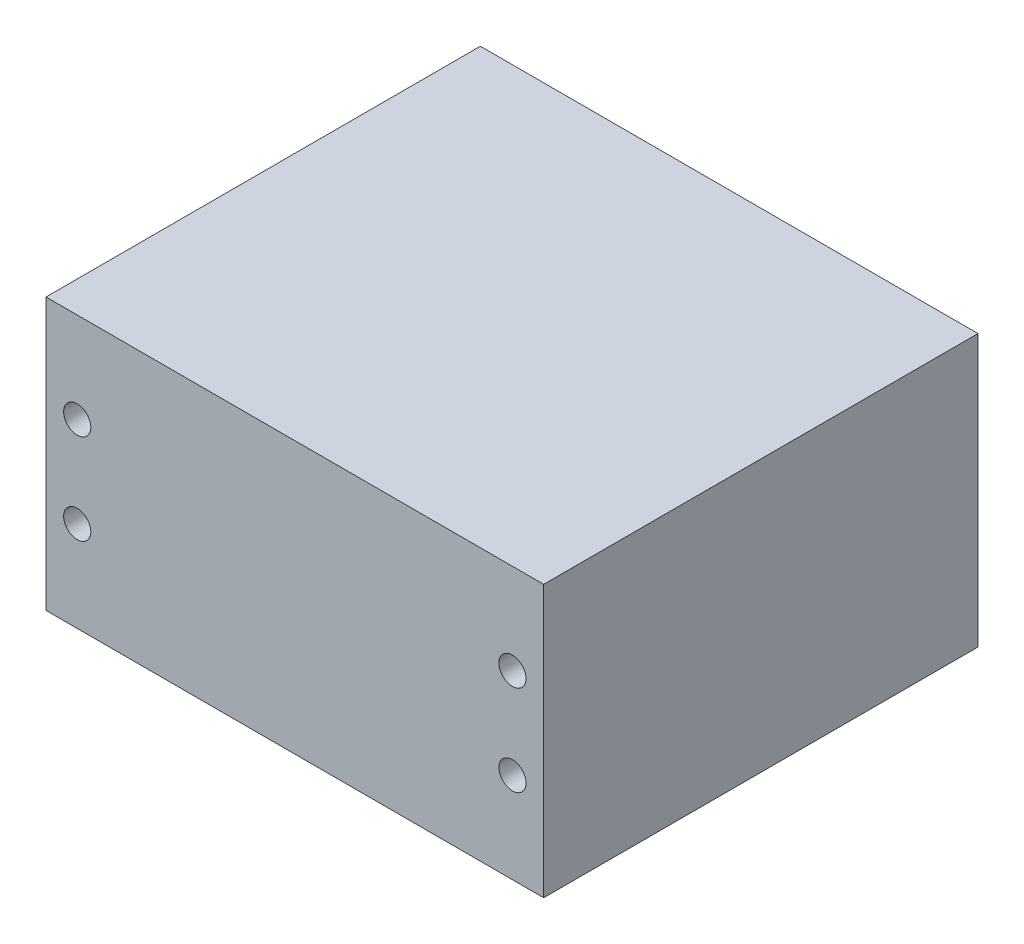
ISO-10303-21;
HEADER;
FILE_DESCRIPTION(('STEP AP214'),'2;1');
FILE_NAME('part.step','',(''),(''),'','','');
FILE_SCHEMA(('AUTOMOTIVE_DESIGN { 1 0 10303 214 1 1 1 1 }'));
ENDSEC;
DATA;
#1=APPLICATION_CONTEXT('core data for automotive mechanical design processes');
#2=APPLICATION_PROTOCOL_DEFINITION('international standard','automotive_design',2000,#1);
#3=PRODUCT_CONTEXT('',#1,'mechanical');
#4=PRODUCT('Part','Part','',(#3));
#5=PRODUCT_RELATED_PRODUCT_CATEGORY('part','',(#4));
#6=PRODUCT_DEFINITION_FORMATION('','',#4);
#7=PRODUCT_DEFINITION_CONTEXT('part definition',#1,'design');
#8=PRODUCT_DEFINITION('design','',#6,#7);
#9=PRODUCT_DEFINITION_SHAPE('','',#8);
#10=(LENGTH_UNIT() NAMED_UNIT(*) SI_UNIT(.MILLI.,.METRE.));
#11=(NAMED_UNIT(*) PLANE_ANGLE_UNIT() SI_UNIT($,.RADIAN.));
#12=(NAMED_UNIT(*) SI_UNIT($,.STERADIAN.) SOLID_ANGLE_UNIT());
#13=UNCERTAINTY_MEASURE_WITH_UNIT(LENGTH_MEASURE(1.E-05),#10,'distance_accuracy_value','');
#14=(GEOMETRIC_REPRESENTATION_CONTEXT(3) GLOBAL_UNCERTAINTY_ASSIGNED_CONTEXT((#13)) GLOBAL_UNIT_ASSIGNED_CONTEXT((#10,
#11,#12)) REPRESENTATION_CONTEXT('',''));
#15=CARTESIAN_POINT('',(0.,0.,0.));
#16=DIRECTION('',(0.,0.,1.));
#17=DIRECTION('',(1.,0.,0.));
#18=AXIS2_PLACEMENT_3D('',#15,#16,#17);
#19=CARTESIAN_POINT('',(0.,0.,48.));
#20=DIRECTION('',(0.,0.,1.));
#21=DIRECTION('',(1.,0.,0.));
#22=AXIS2_PLACEMENT_3D('',#19,#20,#21);
#23=PLANE('',#22);
#24=CARTESIAN_POINT('',(-24.05,-5.,48.));
#25=DIRECTION('',(0.,0.,1.));
#26=DIRECTION('',(-1.,0.,0.));
#27=AXIS2_PLACEMENT_3D('',#24,#25,#26);
#28=CIRCLE('',#27,1.5);
#29=CARTESIAN_POINT('',(-25.55,-5.,48.));
#30=VERTEX_POINT('',#29);
#31=EDGE_CURVE('E137',#30,#30,#28,.T.);
#32=ORIENTED_EDGE('',*,*,#31,.F.);
#33=EDGE_LOOP('',(#32));
#34=FACE_BOUND('',#33,.T.);
#35=CARTESIAN_POINT('',(24.05,5.,48.));
#36=DIRECTION('',(0.,0.,1.));
#37=DIRECTION('',(1.,0.,0.));
#38=AXIS2_PLACEMENT_3D('',#35,#36,#37);
#39=CIRCLE('',#38,1.5);
#40=CARTESIAN_POINT('',(25.55,5.,48.));
#41=VERTEX_POINT('',#40);
#42=EDGE_CURVE('E115',#41,#41,#39,.T.);
#43=ORIENTED_EDGE('',*,*,#42,.F.);
#44=EDGE_LOOP('',(#43));
#45=FACE_BOUND('',#44,.T.);
#46=DIRECTION('',(0.,1.,0.));
#47=VECTOR('',#46,1.);
#48=CARTESIAN_POINT('',(27.5,15.,48.));
#49=LINE('',#48,#47);
#50=CARTESIAN_POINT('',(27.5,-15.,48.));
#51=VERTEX_POINT('',#50);
#52=CARTESIAN_POINT('',(27.5,15.,48.));
#53=VERTEX_POINT('',#52);
#54=EDGE_CURVE('E96',#51,#53,#49,.T.);
#55=ORIENTED_EDGE('',*,*,#54,.T.);
#56=DIRECTION('',(-1.,0.,0.));
#57=VECTOR('',#56,1.);
#58=CARTESIAN_POINT('',(-27.5,15.,48.));
#59=LINE('',#58,#57);
#60=CARTESIAN_POINT('',(-27.5,15.,48.));
#61=VERTEX_POINT('',#60);
#62=EDGE_CURVE('E90',#53,#61,#59,.T.);
#63=ORIENTED_EDGE('',*,*,#62,.T.);
#64=DIRECTION('',(0.,-1.,0.));
#65=VECTOR('',#64,1.);
#66=CARTESIAN_POINT('',(-27.5,15.,48.));
#67=LINE('',#66,#65);
#68=CARTESIAN_POINT('',(-27.5,-15.,48.));
#69=VERTEX_POINT('',#68);
#70=EDGE_CURVE('E94',#61,#69,#67,.T.);
#71=ORIENTED_EDGE('',*,*,#70,.T.);
#72=DIRECTION('',(1.,0.,0.));
#73=VECTOR('',#72,1.);
#74=CARTESIAN_POINT('',(-27.5,-15.,48.));
#75=LINE('',#74,#73);
#76=EDGE_CURVE('E60',#69,#51,#75,.T.);
#77=ORIENTED_EDGE('',*,*,#76,.T.);
#78=EDGE_LOOP('',(#55,#63,#71,#77));
#79=FACE_BOUND('',#78,.T.);
#80=CARTESIAN_POINT('',(24.05,-5.,48.));
#81=DIRECTION('',(0.,0.,1.));
#82=DIRECTION('',(1.,0.,0.));
#83=AXIS2_PLACEMENT_3D('',#80,#81,#82);
#84=CIRCLE('',#83,1.5);
#85=CARTESIAN_POINT('',(25.55,-5.,48.));
#86=VERTEX_POINT('',#85);
#87=EDGE_CURVE('E131',#86,#86,#84,.T.);
#88=ORIENTED_EDGE('',*,*,#87,.F.);
#89=EDGE_LOOP('',(#88));
#90=FACE_BOUND('',#89,.T.);
#91=CARTESIAN_POINT('',(-24.05,5.,48.));
#92=DIRECTION('',(0.,0.,1.));
#93=DIRECTION('',(-1.,0.,0.));
#94=AXIS2_PLACEMENT_3D('',#91,#92,#93);
#95=CIRCLE('',#94,1.5);
#96=CARTESIAN_POINT('',(-25.55,5.,48.));
#97=VERTEX_POINT('',#96);
#98=EDGE_CURVE('E144',#97,#97,#95,.T.);
#99=ORIENTED_EDGE('',*,*,#98,.F.);
#100=EDGE_LOOP('',(#99));
#101=FACE_BOUND('',#100,.T.);
#102=ADVANCED_FACE('F43',(#34,#45,#79,#90,#101),#23,.T.);
#103=CARTESIAN_POINT('',(0.,0.,0.));
#104=DIRECTION('',(0.,0.,1.));
#105=DIRECTION('',(1.,0.,0.));
#106=AXIS2_PLACEMENT_3D('',#103,#104,#105);
#107=PLANE('',#106);
#108=DIRECTION('',(0.,1.,0.));
#109=VECTOR('',#108,1.);
#110=CARTESIAN_POINT('',(27.5,15.,0.));
#111=LINE('',#110,#109);
#112=CARTESIAN_POINT('',(27.5,-15.,0.));
#113=VERTEX_POINT('',#112);
#114=CARTESIAN_POINT('',(27.5,15.,0.));
#115=VERTEX_POINT('',#114);
#116=EDGE_CURVE('E112',#113,#115,#111,.T.);
#117=ORIENTED_EDGE('',*,*,#116,.F.);
#118=DIRECTION('',(1.,0.,0.));
#119=VECTOR('',#118,1.);
#120=CARTESIAN_POINT('',(-27.5,-15.,0.));
#121=LINE('',#120,#119);
#122=CARTESIAN_POINT('',(-27.5,-15.,0.));
#123=VERTEX_POINT('',#122);
#124=EDGE_CURVE('E83',#123,#113,#121,.T.);
#125=ORIENTED_EDGE('',*,*,#124,.F.);
#126=DIRECTION('',(0.,-1.,0.));
#127=VECTOR('',#126,1.);
#128=CARTESIAN_POINT('',(-27.5,15.,0.));
#129=LINE('',#128,#127);
#130=CARTESIAN_POINT('',(-27.5,15.,0.));
#131=VERTEX_POINT('',#130);
#132=EDGE_CURVE('E77',#131,#123,#129,.T.);
#133=ORIENTED_EDGE('',*,*,#132,.F.);
#134=DIRECTION('',(-1.,0.,0.));
#135=VECTOR('',#134,1.);
#136=CARTESIAN_POINT('',(-27.5,15.,0.));
#137=LINE('',#136,#135);
#138=EDGE_CURVE('E101',#115,#131,#137,.T.);
#139=ORIENTED_EDGE('',*,*,#138,.F.);
#140=EDGE_LOOP('',(#117,#125,#133,#139));
#141=FACE_BOUND('',#140,.T.);
#142=CARTESIAN_POINT('',(24.05,5.,0.));
#143=DIRECTION('',(0.,0.,1.));
#144=DIRECTION('',(1.,0.,0.));
#145=AXIS2_PLACEMENT_3D('',#142,#143,#144);
#146=CIRCLE('',#145,1.5);
#147=CARTESIAN_POINT('',(25.55,5.,0.));
#148=VERTEX_POINT('',#147);
#149=EDGE_CURVE('E128',#148,#148,#146,.T.);
#150=ORIENTED_EDGE('',*,*,#149,.T.);
#151=EDGE_LOOP('',(#150));
#152=FACE_BOUND('',#151,.T.);
#153=CARTESIAN_POINT('',(24.05,-5.,0.));
#154=DIRECTION('',(0.,0.,1.));
#155=DIRECTION('',(1.,0.,0.));
#156=AXIS2_PLACEMENT_3D('',#153,#154,#155);
#157=CIRCLE('',#156,1.5);
#158=CARTESIAN_POINT('',(25.55,-5.,0.));
#159=VERTEX_POINT('',#158);
#160=EDGE_CURVE('E134',#159,#159,#157,.T.);
#161=ORIENTED_EDGE('',*,*,#160,.T.);
#162=EDGE_LOOP('',(#161));
#163=FACE_BOUND('',#162,.T.);
#164=CARTESIAN_POINT('',(-24.05,-5.,0.));
#165=DIRECTION('',(0.,0.,1.));
#166=DIRECTION('',(-1.,0.,0.));
#167=AXIS2_PLACEMENT_3D('',#164,#165,#166);
#168=CIRCLE('',#167,1.5);
#169=CARTESIAN_POINT('',(-25.55,-5.,0.));
#170=VERTEX_POINT('',#169);
#171=EDGE_CURVE('E140',#170,#170,#168,.T.);
#172=ORIENTED_EDGE('',*,*,#171,.T.);
#173=EDGE_LOOP('',(#172));
#174=FACE_BOUND('',#173,.T.);
#175=CARTESIAN_POINT('',(-24.05,5.,0.));
#176=DIRECTION('',(0.,0.,1.));
#177=DIRECTION('',(-1.,0.,0.));
#178=AXIS2_PLACEMENT_3D('',#175,#176,#177);
#179=CIRCLE('',#178,1.5);
#180=CARTESIAN_POINT('',(-25.55,5.,0.));
#181=VERTEX_POINT('',#180);
#182=EDGE_CURVE('E147',#181,#181,#179,.T.);
#183=ORIENTED_EDGE('',*,*,#182,.T.);
#184=EDGE_LOOP('',(#183));
#185=FACE_BOUND('',#184,.T.);
#186=ADVANCED_FACE('F124',(#141,#152,#163,#174,#185),#107,.F.);
#187=CARTESIAN_POINT('',(27.5,15.,48.));
#188=DIRECTION('',(-1.,0.,0.));
#189=DIRECTION('',(0.,-1.,0.));
#190=AXIS2_PLACEMENT_3D('',#187,#188,#189);
#191=PLANE('',#190);
#192=ORIENTED_EDGE('',*,*,#116,.T.);
#193=DIRECTION('',(0.,0.,-1.));
#194=VECTOR('',#193,1.);
#195=CARTESIAN_POINT('',(27.5,15.,48.));
#196=LINE('',#195,#194);
#197=EDGE_CURVE('E11',#53,#115,#196,.T.);
#198=ORIENTED_EDGE('',*,*,#197,.F.);
#199=ORIENTED_EDGE('',*,*,#54,.F.);
#200=DIRECTION('',(0.,0.,-1.));
#201=VECTOR('',#200,1.);
#202=CARTESIAN_POINT('',(27.5,-15.,48.));
#203=LINE('',#202,#201);
#204=EDGE_CURVE('E108',#51,#113,#203,.T.);
#205=ORIENTED_EDGE('',*,*,#204,.T.);
#206=EDGE_LOOP('',(#192,#198,#199,#205));
#207=FACE_BOUND('',#206,.T.);
#208=ADVANCED_FACE('F45',(#207),#191,.F.);
#209=CARTESIAN_POINT('',(-27.5,15.,48.));
#210=DIRECTION('',(0.,-1.,0.));
#211=DIRECTION('',(0.,0.,-1.));
#212=AXIS2_PLACEMENT_3D('',#209,#210,#211);
#213=PLANE('',#212);
#214=ORIENTED_EDGE('',*,*,#138,.T.);
#215=DIRECTION('',(0.,0.,-1.));
#216=VECTOR('',#215,1.);
#217=CARTESIAN_POINT('',(-27.5,15.,48.));
#218=LINE('',#217,#216);
#219=EDGE_CURVE('E52',#61,#131,#218,.T.);
#220=ORIENTED_EDGE('',*,*,#219,.F.);
#221=ORIENTED_EDGE('',*,*,#62,.F.);
#222=ORIENTED_EDGE('',*,*,#197,.T.);
#223=EDGE_LOOP('',(#214,#220,#221,#222));
#224=FACE_BOUND('',#223,.T.);
#225=ADVANCED_FACE('F100',(#224),#213,.F.);
#226=CARTESIAN_POINT('',(-27.5,15.,48.));
#227=DIRECTION('',(1.,0.,0.));
#228=DIRECTION('',(0.,1.,0.));
#229=AXIS2_PLACEMENT_3D('',#226,#227,#228);
#230=PLANE('',#229);
#231=ORIENTED_EDGE('',*,*,#132,.T.);
#232=DIRECTION('',(0.,0.,-1.));
#233=VECTOR('',#232,1.);
#234=CARTESIAN_POINT('',(-27.5,-15.,48.));
#235=LINE('',#234,#233);
#236=EDGE_CURVE('E103',#69,#123,#235,.T.);
#237=ORIENTED_EDGE('',*,*,#236,.F.);
#238=ORIENTED_EDGE('',*,*,#70,.F.);
#239=ORIENTED_EDGE('',*,*,#219,.T.);
#240=EDGE_LOOP('',(#231,#237,#238,#239));
#241=FACE_BOUND('',#240,.T.);
#242=ADVANCED_FACE('F104',(#241),#230,.F.);
#243=CARTESIAN_POINT('',(-27.5,-15.,48.));
#244=DIRECTION('',(0.,1.,0.));
#245=DIRECTION('',(0.,0.,1.));
#246=AXIS2_PLACEMENT_3D('',#243,#244,#245);
#247=PLANE('',#246);
#248=ORIENTED_EDGE('',*,*,#124,.T.);
#249=ORIENTED_EDGE('',*,*,#204,.F.);
#250=ORIENTED_EDGE('',*,*,#76,.F.);
#251=ORIENTED_EDGE('',*,*,#236,.T.);
#252=EDGE_LOOP('',(#248,#249,#250,#251));
#253=FACE_BOUND('',#252,.T.);
#254=ADVANCED_FACE('F121',(#253),#247,.F.);
#255=CARTESIAN_POINT('',(24.05,5.,48.));
#256=DIRECTION('',(0.,0.,-1.));
#257=DIRECTION('',(-1.,0.,0.));
#258=AXIS2_PLACEMENT_3D('',#255,#256,#257);
#259=CYLINDRICAL_SURFACE('',#258,1.5);
#260=ORIENTED_EDGE('',*,*,#42,.T.);
#261=EDGE_LOOP('',(#260));
#262=FACE_BOUND('',#261,.T.);
#263=ORIENTED_EDGE('',*,*,#149,.F.);
#264=EDGE_LOOP('',(#263));
#265=FACE_BOUND('',#264,.T.);
#266=ADVANCED_FACE('F167',(#262,#265),#259,.F.);
#267=CARTESIAN_POINT('',(24.05,-5.,48.));
#268=DIRECTION('',(0.,0.,-1.));
#269=DIRECTION('',(-1.,0.,0.));
#270=AXIS2_PLACEMENT_3D('',#267,#268,#269);
#271=CYLINDRICAL_SURFACE('',#270,1.5);
#272=ORIENTED_EDGE('',*,*,#87,.T.);
#273=EDGE_LOOP('',(#272));
#274=FACE_BOUND('',#273,.T.);
#275=ORIENTED_EDGE('',*,*,#160,.F.);
#276=EDGE_LOOP('',(#275));
#277=FACE_BOUND('',#276,.T.);
#278=ADVANCED_FACE('F205',(#274,#277),#271,.F.);
#279=CARTESIAN_POINT('',(-24.05,-5.,48.));
#280=DIRECTION('',(0.,0.,-1.));
#281=DIRECTION('',(-1.,0.,0.));
#282=AXIS2_PLACEMENT_3D('',#279,#280,#281);
#283=CYLINDRICAL_SURFACE('',#282,1.5);
#284=ORIENTED_EDGE('',*,*,#31,.T.);
#285=EDGE_LOOP('',(#284));
#286=FACE_BOUND('',#285,.T.);
#287=ORIENTED_EDGE('',*,*,#171,.F.);
#288=EDGE_LOOP('',(#287));
#289=FACE_BOUND('',#288,.T.);
#290=ADVANCED_FACE('F212',(#286,#289),#283,.F.);
#291=CARTESIAN_POINT('',(-24.05,5.,48.));
#292=DIRECTION('',(0.,0.,-1.));
#293=DIRECTION('',(-1.,0.,0.));
#294=AXIS2_PLACEMENT_3D('',#291,#292,#293);
#295=CYLINDRICAL_SURFACE('',#294,1.5);
#296=ORIENTED_EDGE('',*,*,#98,.T.);
#297=EDGE_LOOP('',(#296));
#298=FACE_BOUND('',#297,.T.);
#299=ORIENTED_EDGE('',*,*,#182,.F.);
#300=EDGE_LOOP('',(#299));
#301=FACE_BOUND('',#300,.T.);
#302=ADVANCED_FACE('F154',(#298,#301),#295,.F.);
#303=CLOSED_SHELL('',(#102,#186,#208,#225,#242,#254,#266,#278,#290,#302));
#304=MANIFOLD_SOLID_BREP('B2',#303);
#305=ADVANCED_BREP_SHAPE_REPRESENTATION('',(#18,#304),#14);
#306=SHAPE_DEFINITION_REPRESENTATION(#9,#305);
ENDSEC;
END-ISO-10303-21;
